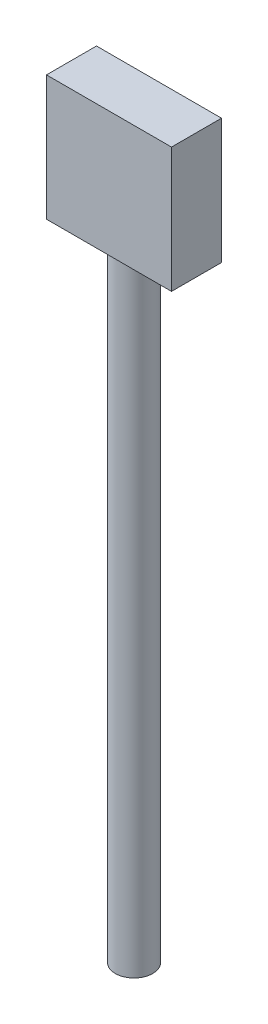
ISO-10303-21;
HEADER;
FILE_DESCRIPTION(('STEP AP214'),'2;1');
FILE_NAME('part.step','',(''),(''),'','','');
FILE_SCHEMA(('AUTOMOTIVE_DESIGN { 1 0 10303 214 1 1 1 1 }'));
ENDSEC;
DATA;
#1=APPLICATION_CONTEXT('core data for automotive mechanical design processes');
#2=APPLICATION_PROTOCOL_DEFINITION('international standard','automotive_design',2000,#1);
#3=PRODUCT_CONTEXT('',#1,'mechanical');
#4=PRODUCT('Part','Part','',(#3));
#5=PRODUCT_RELATED_PRODUCT_CATEGORY('part','',(#4));
#6=PRODUCT_DEFINITION_FORMATION('','',#4);
#7=PRODUCT_DEFINITION_CONTEXT('part definition',#1,'design');
#8=PRODUCT_DEFINITION('design','',#6,#7);
#9=PRODUCT_DEFINITION_SHAPE('','',#8);
#10=(LENGTH_UNIT() NAMED_UNIT(*) SI_UNIT(.MILLI.,.METRE.));
#11=(NAMED_UNIT(*) PLANE_ANGLE_UNIT() SI_UNIT($,.RADIAN.));
#12=(NAMED_UNIT(*) SI_UNIT($,.STERADIAN.) SOLID_ANGLE_UNIT());
#13=UNCERTAINTY_MEASURE_WITH_UNIT(LENGTH_MEASURE(1.E-05),#10,'distance_accuracy_value','');
#14=(GEOMETRIC_REPRESENTATION_CONTEXT(3) GLOBAL_UNCERTAINTY_ASSIGNED_CONTEXT((#13)) GLOBAL_UNIT_ASSIGNED_CONTEXT((#10,
#11,#12)) REPRESENTATION_CONTEXT('',''));
#15=CARTESIAN_POINT('',(0.,0.,0.));
#16=DIRECTION('',(0.,0.,1.));
#17=DIRECTION('',(1.,0.,0.));
#18=AXIS2_PLACEMENT_3D('',#15,#16,#17);
#19=CARTESIAN_POINT('',(0.,50.,0.));
#20=DIRECTION('',(0.,-1.,0.));
#21=DIRECTION('',(0.,0.,-1.));
#22=AXIS2_PLACEMENT_3D('',#19,#20,#21);
#23=CYLINDRICAL_SURFACE('',#22,1.5);
#24=CARTESIAN_POINT('',(0.,50.,0.));
#25=DIRECTION('',(0.,1.,0.));
#26=DIRECTION('',(0.,0.,1.));
#27=AXIS2_PLACEMENT_3D('',#24,#25,#26);
#28=CIRCLE('',#27,1.5);
#29=CARTESIAN_POINT('',(0.,50.,1.5));
#30=VERTEX_POINT('',#29);
#31=EDGE_CURVE('E11',#30,#30,#28,.T.);
#32=ORIENTED_EDGE('',*,*,#31,.F.);
#33=EDGE_LOOP('',(#32));
#34=FACE_BOUND('',#33,.T.);
#35=CARTESIAN_POINT('',(0.,0.,0.));
#36=DIRECTION('',(0.,1.,0.));
#37=DIRECTION('',(0.,0.,1.));
#38=AXIS2_PLACEMENT_3D('',#35,#36,#37);
#39=CIRCLE('',#38,1.5);
#40=CARTESIAN_POINT('',(0.,0.,1.5));
#41=VERTEX_POINT('',#40);
#42=EDGE_CURVE('E37',#41,#41,#39,.T.);
#43=ORIENTED_EDGE('',*,*,#42,.T.);
#44=EDGE_LOOP('',(#43));
#45=FACE_BOUND('',#44,.T.);
#46=ADVANCED_FACE('F34',(#34,#45),#23,.T.);
#47=CARTESIAN_POINT('',(0.,0.,0.));
#48=DIRECTION('',(0.,1.,0.));
#49=DIRECTION('',(0.,0.,1.));
#50=AXIS2_PLACEMENT_3D('',#47,#48,#49);
#51=PLANE('',#50);
#52=ORIENTED_EDGE('',*,*,#42,.F.);
#53=EDGE_LOOP('',(#52));
#54=FACE_BOUND('',#53,.T.);
#55=ADVANCED_FACE('F113',(#54),#51,.F.);
#56=CARTESIAN_POINT('',(5.,50.,-2.));
#57=DIRECTION('',(0.,-1.,0.));
#58=DIRECTION('',(0.,0.,-1.));
#59=AXIS2_PLACEMENT_3D('',#56,#57,#58);
#60=PLANE('',#59);
#61=DIRECTION('',(0.,0.,-1.));
#62=VECTOR('',#61,1.);
#63=CARTESIAN_POINT('',(5.,50.,2.));
#64=LINE('',#63,#62);
#65=CARTESIAN_POINT('',(5.,50.,2.));
#66=VERTEX_POINT('',#65);
#67=CARTESIAN_POINT('',(5.,50.,-2.));
#68=VERTEX_POINT('',#67);
#69=EDGE_CURVE('E101',#66,#68,#64,.T.);
#70=ORIENTED_EDGE('',*,*,#69,.F.);
#71=DIRECTION('',(1.,0.,0.));
#72=VECTOR('',#71,1.);
#73=CARTESIAN_POINT('',(-5.,50.,2.));
#74=LINE('',#73,#72);
#75=CARTESIAN_POINT('',(-5.,50.,2.));
#76=VERTEX_POINT('',#75);
#77=EDGE_CURVE('E73',#76,#66,#74,.T.);
#78=ORIENTED_EDGE('',*,*,#77,.F.);
#79=DIRECTION('',(0.,0.,1.));
#80=VECTOR('',#79,1.);
#81=CARTESIAN_POINT('',(-5.,50.,2.));
#82=LINE('',#81,#80);
#83=CARTESIAN_POINT('',(-5.,50.,-2.));
#84=VERTEX_POINT('',#83);
#85=EDGE_CURVE('E67',#84,#76,#82,.T.);
#86=ORIENTED_EDGE('',*,*,#85,.F.);
#87=DIRECTION('',(-1.,0.,0.));
#88=VECTOR('',#87,1.);
#89=CARTESIAN_POINT('',(-5.,50.,-2.));
#90=LINE('',#89,#88);
#91=EDGE_CURVE('E91',#68,#84,#90,.T.);
#92=ORIENTED_EDGE('',*,*,#91,.F.);
#93=EDGE_LOOP('',(#70,#78,#86,#92));
#94=FACE_BOUND('',#93,.T.);
#95=ORIENTED_EDGE('',*,*,#31,.T.);
#96=EDGE_LOOP('',(#95));
#97=FACE_BOUND('',#96,.T.);
#98=ADVANCED_FACE('F115',(#94,#97),#60,.T.);
#99=CARTESIAN_POINT('',(5.,60.,2.));
#100=DIRECTION('',(-1.,0.,0.));
#101=DIRECTION('',(0.,0.,1.));
#102=AXIS2_PLACEMENT_3D('',#99,#100,#101);
#103=PLANE('',#102);
#104=ORIENTED_EDGE('',*,*,#69,.T.);
#105=DIRECTION('',(0.,-1.,0.));
#106=VECTOR('',#105,1.);
#107=CARTESIAN_POINT('',(5.,60.,-2.));
#108=LINE('',#107,#106);
#109=CARTESIAN_POINT('',(5.,60.,-2.));
#110=VERTEX_POINT('',#109);
#111=EDGE_CURVE('E92',#110,#68,#108,.T.);
#112=ORIENTED_EDGE('',*,*,#111,.F.);
#113=DIRECTION('',(0.,0.,-1.));
#114=VECTOR('',#113,1.);
#115=CARTESIAN_POINT('',(5.,60.,2.));
#116=LINE('',#115,#114);
#117=CARTESIAN_POINT('',(5.,60.,2.));
#118=VERTEX_POINT('',#117);
#119=EDGE_CURVE('E86',#118,#110,#116,.T.);
#120=ORIENTED_EDGE('',*,*,#119,.F.);
#121=DIRECTION('',(0.,-1.,0.));
#122=VECTOR('',#121,1.);
#123=CARTESIAN_POINT('',(5.,60.,2.));
#124=LINE('',#123,#122);
#125=EDGE_CURVE('E97',#118,#66,#124,.T.);
#126=ORIENTED_EDGE('',*,*,#125,.T.);
#127=EDGE_LOOP('',(#104,#112,#120,#126));
#128=FACE_BOUND('',#127,.T.);
#129=ADVANCED_FACE('F120',(#128),#103,.F.);
#130=CARTESIAN_POINT('',(-5.,60.,-2.));
#131=DIRECTION('',(0.,0.,1.));
#132=DIRECTION('',(1.,0.,0.));
#133=AXIS2_PLACEMENT_3D('',#130,#131,#132);
#134=PLANE('',#133);
#135=ORIENTED_EDGE('',*,*,#91,.T.);
#136=DIRECTION('',(0.,-1.,0.));
#137=VECTOR('',#136,1.);
#138=CARTESIAN_POINT('',(-5.,60.,-2.));
#139=LINE('',#138,#137);
#140=CARTESIAN_POINT('',(-5.,60.,-2.));
#141=VERTEX_POINT('',#140);
#142=EDGE_CURVE('E89',#141,#84,#139,.T.);
#143=ORIENTED_EDGE('',*,*,#142,.F.);
#144=DIRECTION('',(-1.,0.,0.));
#145=VECTOR('',#144,1.);
#146=CARTESIAN_POINT('',(-5.,60.,-2.));
#147=LINE('',#146,#145);
#148=EDGE_CURVE('E81',#110,#141,#147,.T.);
#149=ORIENTED_EDGE('',*,*,#148,.F.);
#150=ORIENTED_EDGE('',*,*,#111,.T.);
#151=EDGE_LOOP('',(#135,#143,#149,#150));
#152=FACE_BOUND('',#151,.T.);
#153=ADVANCED_FACE('F90',(#152),#134,.F.);
#154=CARTESIAN_POINT('',(-5.,60.,2.));
#155=DIRECTION('',(1.,0.,0.));
#156=DIRECTION('',(0.,0.,-1.));
#157=AXIS2_PLACEMENT_3D('',#154,#155,#156);
#158=PLANE('',#157);
#159=ORIENTED_EDGE('',*,*,#85,.T.);
#160=DIRECTION('',(0.,-1.,0.));
#161=VECTOR('',#160,1.);
#162=CARTESIAN_POINT('',(-5.,60.,2.));
#163=LINE('',#162,#161);
#164=CARTESIAN_POINT('',(-5.,60.,2.));
#165=VERTEX_POINT('',#164);
#166=EDGE_CURVE('E93',#165,#76,#163,.T.);
#167=ORIENTED_EDGE('',*,*,#166,.F.);
#168=DIRECTION('',(0.,0.,1.));
#169=VECTOR('',#168,1.);
#170=CARTESIAN_POINT('',(-5.,60.,2.));
#171=LINE('',#170,#169);
#172=EDGE_CURVE('E84',#141,#165,#171,.T.);
#173=ORIENTED_EDGE('',*,*,#172,.F.);
#174=ORIENTED_EDGE('',*,*,#142,.T.);
#175=EDGE_LOOP('',(#159,#167,#173,#174));
#176=FACE_BOUND('',#175,.T.);
#177=ADVANCED_FACE('F95',(#176),#158,.F.);
#178=CARTESIAN_POINT('',(-5.,60.,2.));
#179=DIRECTION('',(0.,0.,-1.));
#180=DIRECTION('',(-1.,0.,0.));
#181=AXIS2_PLACEMENT_3D('',#178,#179,#180);
#182=PLANE('',#181);
#183=ORIENTED_EDGE('',*,*,#77,.T.);
#184=ORIENTED_EDGE('',*,*,#125,.F.);
#185=DIRECTION('',(1.,0.,0.));
#186=VECTOR('',#185,1.);
#187=CARTESIAN_POINT('',(-5.,60.,2.));
#188=LINE('',#187,#186);
#189=EDGE_CURVE('E50',#165,#118,#188,.T.);
#190=ORIENTED_EDGE('',*,*,#189,.F.);
#191=ORIENTED_EDGE('',*,*,#166,.T.);
#192=EDGE_LOOP('',(#183,#184,#190,#191));
#193=FACE_BOUND('',#192,.T.);
#194=ADVANCED_FACE('F132',(#193),#182,.F.);
#195=CARTESIAN_POINT('',(5.,60.,-2.));
#196=DIRECTION('',(0.,-1.,0.));
#197=DIRECTION('',(0.,0.,-1.));
#198=AXIS2_PLACEMENT_3D('',#195,#196,#197);
#199=PLANE('',#198);
#200=ORIENTED_EDGE('',*,*,#119,.T.);
#201=ORIENTED_EDGE('',*,*,#148,.T.);
#202=ORIENTED_EDGE('',*,*,#172,.T.);
#203=ORIENTED_EDGE('',*,*,#189,.T.);
#204=EDGE_LOOP('',(#200,#201,#202,#203));
#205=FACE_BOUND('',#204,.T.);
#206=ADVANCED_FACE('F82',(#205),#199,.F.);
#207=CLOSED_SHELL('',(#46,#55,#98,#129,#153,#177,#194,#206));
#208=MANIFOLD_SOLID_BREP('B2',#207);
#209=ADVANCED_BREP_SHAPE_REPRESENTATION('',(#18,#208),#14);
#210=SHAPE_DEFINITION_REPRESENTATION(#9,#209);
ENDSEC;
END-ISO-10303-21;
